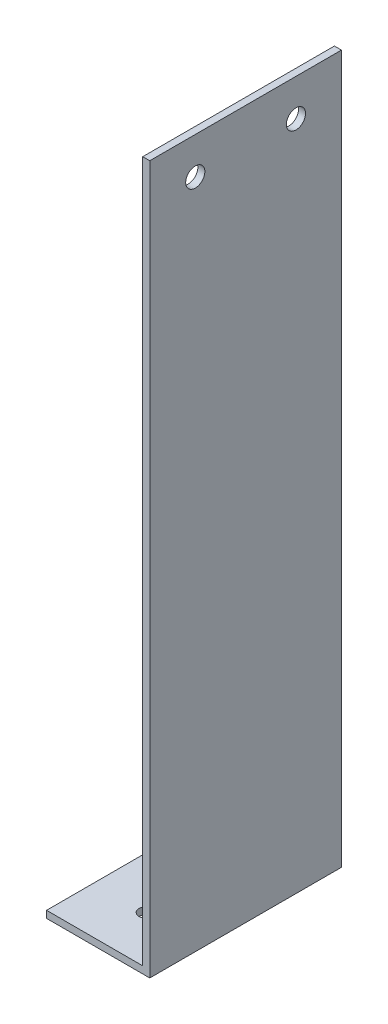
ISO-10303-21;
HEADER;
FILE_DESCRIPTION(('STEP AP214'),'2;1');
FILE_NAME('part.step','',(''),(''),'','','');
FILE_SCHEMA(('AUTOMOTIVE_DESIGN { 1 0 10303 214 1 1 1 1 }'));
ENDSEC;
DATA;
#1=APPLICATION_CONTEXT('core data for automotive mechanical design processes');
#2=APPLICATION_PROTOCOL_DEFINITION('international standard','automotive_design',2000,#1);
#3=PRODUCT_CONTEXT('',#1,'mechanical');
#4=PRODUCT('Part','Part','',(#3));
#5=PRODUCT_RELATED_PRODUCT_CATEGORY('part','',(#4));
#6=PRODUCT_DEFINITION_FORMATION('','',#4);
#7=PRODUCT_DEFINITION_CONTEXT('part definition',#1,'design');
#8=PRODUCT_DEFINITION('design','',#6,#7);
#9=PRODUCT_DEFINITION_SHAPE('','',#8);
#10=(LENGTH_UNIT() NAMED_UNIT(*) SI_UNIT(.MILLI.,.METRE.));
#11=(NAMED_UNIT(*) PLANE_ANGLE_UNIT() SI_UNIT($,.RADIAN.));
#12=(NAMED_UNIT(*) SI_UNIT($,.STERADIAN.) SOLID_ANGLE_UNIT());
#13=UNCERTAINTY_MEASURE_WITH_UNIT(LENGTH_MEASURE(1.E-05),#10,'distance_accuracy_value','');
#14=(GEOMETRIC_REPRESENTATION_CONTEXT(3) GLOBAL_UNCERTAINTY_ASSIGNED_CONTEXT((#13)) GLOBAL_UNIT_ASSIGNED_CONTEXT((#10,
#11,#12)) REPRESENTATION_CONTEXT('',''));
#15=CARTESIAN_POINT('',(0.,0.,0.));
#16=DIRECTION('',(0.,0.,1.));
#17=DIRECTION('',(1.,0.,0.));
#18=AXIS2_PLACEMENT_3D('',#15,#16,#17);
#19=CARTESIAN_POINT('',(0.,0.,65.));
#20=DIRECTION('',(0.,1.,0.));
#21=DIRECTION('',(-1.,0.,0.));
#22=AXIS2_PLACEMENT_3D('',#19,#20,#21);
#23=PLANE('',#22);
#24=CARTESIAN_POINT('',(-35.,0.,32.5));
#25=DIRECTION('',(0.,-1.,0.));
#26=DIRECTION('',(1.,0.,0.));
#27=AXIS2_PLACEMENT_3D('',#24,#25,#26);
#28=CIRCLE('',#27,4.7625);
#29=CARTESIAN_POINT('',(-30.2375,0.,32.5));
#30=VERTEX_POINT('',#29);
#31=EDGE_CURVE('E161',#30,#30,#28,.T.);
#32=ORIENTED_EDGE('',*,*,#31,.F.);
#33=EDGE_LOOP('',(#32));
#34=FACE_BOUND('',#33,.T.);
#35=CARTESIAN_POINT('',(-35.,0.,-32.5));
#36=DIRECTION('',(0.,-1.,0.));
#37=DIRECTION('',(1.,0.,0.));
#38=AXIS2_PLACEMENT_3D('',#35,#36,#37);
#39=CIRCLE('',#38,4.7625);
#40=CARTESIAN_POINT('',(-30.2375,0.,-32.5));
#41=VERTEX_POINT('',#40);
#42=EDGE_CURVE('E173',#41,#41,#39,.T.);
#43=ORIENTED_EDGE('',*,*,#42,.F.);
#44=EDGE_LOOP('',(#43));
#45=FACE_BOUND('',#44,.T.);
#46=DIRECTION('',(1.,0.,0.));
#47=VECTOR('',#46,1.);
#48=CARTESIAN_POINT('',(0.,0.,-65.));
#49=LINE('',#48,#47);
#50=CARTESIAN_POINT('',(-70.,0.,-65.));
#51=VERTEX_POINT('',#50);
#52=CARTESIAN_POINT('',(0.,0.,-65.));
#53=VERTEX_POINT('',#52);
#54=EDGE_CURVE('E130',#51,#53,#49,.T.);
#55=ORIENTED_EDGE('',*,*,#54,.T.);
#56=DIRECTION('',(0.,0.,-1.));
#57=VECTOR('',#56,1.);
#58=CARTESIAN_POINT('',(0.,0.,65.));
#59=LINE('',#58,#57);
#60=CARTESIAN_POINT('',(0.,0.,65.));
#61=VERTEX_POINT('',#60);
#62=EDGE_CURVE('E11',#61,#53,#59,.T.);
#63=ORIENTED_EDGE('',*,*,#62,.F.);
#64=DIRECTION('',(1.,0.,0.));
#65=VECTOR('',#64,1.);
#66=CARTESIAN_POINT('',(0.,0.,65.));
#67=LINE('',#66,#65);
#68=CARTESIAN_POINT('',(-70.,0.,65.));
#69=VERTEX_POINT('',#68);
#70=EDGE_CURVE('E147',#69,#61,#67,.T.);
#71=ORIENTED_EDGE('',*,*,#70,.F.);
#72=DIRECTION('',(0.,0.,-1.));
#73=VECTOR('',#72,1.);
#74=CARTESIAN_POINT('',(-70.,0.,65.));
#75=LINE('',#74,#73);
#76=EDGE_CURVE('E126',#69,#51,#75,.T.);
#77=ORIENTED_EDGE('',*,*,#76,.T.);
#78=EDGE_LOOP('',(#55,#63,#71,#77));
#79=FACE_BOUND('',#78,.T.);
#80=ADVANCED_FACE('F39',(#34,#45,#79),#23,.F.);
#81=CARTESIAN_POINT('',(0.,0.,65.));
#82=DIRECTION('',(-1.,0.,0.));
#83=DIRECTION('',(0.,0.,1.));
#84=AXIS2_PLACEMENT_3D('',#81,#82,#83);
#85=PLANE('',#84);
#86=CARTESIAN_POINT('',(0.,455.,34.13125));
#87=DIRECTION('',(1.,0.,0.));
#88=DIRECTION('',(0.,0.,-1.));
#89=AXIS2_PLACEMENT_3D('',#86,#87,#88);
#90=CIRCLE('',#89,6.5);
#91=CARTESIAN_POINT('',(0.,455.,27.63125));
#92=VERTEX_POINT('',#91);
#93=EDGE_CURVE('E167',#92,#92,#90,.T.);
#94=ORIENTED_EDGE('',*,*,#93,.F.);
#95=EDGE_LOOP('',(#94));
#96=FACE_BOUND('',#95,.T.);
#97=CARTESIAN_POINT('',(0.,455.,-34.13125));
#98=DIRECTION('',(1.,0.,0.));
#99=DIRECTION('',(0.,0.,1.));
#100=AXIS2_PLACEMENT_3D('',#97,#98,#99);
#101=CIRCLE('',#100,6.50000000000001);
#102=CARTESIAN_POINT('',(0.,455.,-27.63125));
#103=VERTEX_POINT('',#102);
#104=EDGE_CURVE('E175',#103,#103,#101,.T.);
#105=ORIENTED_EDGE('',*,*,#104,.F.);
#106=EDGE_LOOP('',(#105));
#107=FACE_BOUND('',#106,.T.);
#108=DIRECTION('',(0.,1.,0.));
#109=VECTOR('',#108,1.);
#110=CARTESIAN_POINT('',(0.,0.,-65.));
#111=LINE('',#110,#109);
#112=CARTESIAN_POINT('',(0.,480.,-65.));
#113=VERTEX_POINT('',#112);
#114=EDGE_CURVE('E134',#53,#113,#111,.T.);
#115=ORIENTED_EDGE('',*,*,#114,.T.);
#116=DIRECTION('',(0.,0.,-1.));
#117=VECTOR('',#116,1.);
#118=CARTESIAN_POINT('',(0.,480.,65.));
#119=LINE('',#118,#117);
#120=CARTESIAN_POINT('',(0.,480.,65.));
#121=VERTEX_POINT('',#120);
#122=EDGE_CURVE('E49',#121,#113,#119,.T.);
#123=ORIENTED_EDGE('',*,*,#122,.F.);
#124=DIRECTION('',(0.,1.,0.));
#125=VECTOR('',#124,1.);
#126=CARTESIAN_POINT('',(0.,0.,65.));
#127=LINE('',#126,#125);
#128=EDGE_CURVE('E95',#61,#121,#127,.T.);
#129=ORIENTED_EDGE('',*,*,#128,.F.);
#130=ORIENTED_EDGE('',*,*,#62,.T.);
#131=EDGE_LOOP('',(#115,#123,#129,#130));
#132=FACE_BOUND('',#131,.T.);
#133=ADVANCED_FACE('F195',(#96,#107,#132),#85,.F.);
#134=CARTESIAN_POINT('',(0.,480.,65.));
#135=DIRECTION('',(0.,-1.,0.));
#136=DIRECTION('',(0.,0.,-1.));
#137=AXIS2_PLACEMENT_3D('',#134,#135,#136);
#138=PLANE('',#137);
#139=DIRECTION('',(-1.,0.,0.));
#140=VECTOR('',#139,1.);
#141=CARTESIAN_POINT('',(0.,480.,-65.));
#142=LINE('',#141,#140);
#143=CARTESIAN_POINT('',(-4.7625,480.,-65.));
#144=VERTEX_POINT('',#143);
#145=EDGE_CURVE('E138',#113,#144,#142,.T.);
#146=ORIENTED_EDGE('',*,*,#145,.T.);
#147=DIRECTION('',(0.,0.,-1.));
#148=VECTOR('',#147,1.);
#149=CARTESIAN_POINT('',(-4.7625,480.,65.));
#150=LINE('',#149,#148);
#151=CARTESIAN_POINT('',(-4.7625,480.,65.));
#152=VERTEX_POINT('',#151);
#153=EDGE_CURVE('E119',#152,#144,#150,.T.);
#154=ORIENTED_EDGE('',*,*,#153,.F.);
#155=DIRECTION('',(-1.,0.,0.));
#156=VECTOR('',#155,1.);
#157=CARTESIAN_POINT('',(0.,480.,65.));
#158=LINE('',#157,#156);
#159=EDGE_CURVE('E108',#121,#152,#158,.T.);
#160=ORIENTED_EDGE('',*,*,#159,.F.);
#161=ORIENTED_EDGE('',*,*,#122,.T.);
#162=EDGE_LOOP('',(#146,#154,#160,#161));
#163=FACE_BOUND('',#162,.T.);
#164=ADVANCED_FACE('F198',(#163),#138,.F.);
#165=CARTESIAN_POINT('',(-4.7625,4.7625,65.));
#166=DIRECTION('',(1.,0.,0.));
#167=DIRECTION('',(0.,0.,-1.));
#168=AXIS2_PLACEMENT_3D('',#165,#166,#167);
#169=PLANE('',#168);
#170=CARTESIAN_POINT('',(-4.7625,455.,34.13125));
#171=DIRECTION('',(1.,0.,0.));
#172=DIRECTION('',(0.,0.,-1.));
#173=AXIS2_PLACEMENT_3D('',#170,#171,#172);
#174=CIRCLE('',#173,6.5);
#175=CARTESIAN_POINT('',(-4.7625,455.,27.63125));
#176=VERTEX_POINT('',#175);
#177=EDGE_CURVE('E42',#176,#176,#174,.T.);
#178=ORIENTED_EDGE('',*,*,#177,.T.);
#179=EDGE_LOOP('',(#178));
#180=FACE_BOUND('',#179,.T.);
#181=CARTESIAN_POINT('',(-4.7625,455.,-34.13125));
#182=DIRECTION('',(1.,0.,0.));
#183=DIRECTION('',(0.,0.,-1.));
#184=AXIS2_PLACEMENT_3D('',#181,#182,#183);
#185=CIRCLE('',#184,6.50000000000001);
#186=CARTESIAN_POINT('',(-4.7625,455.,-40.63125));
#187=VERTEX_POINT('',#186);
#188=EDGE_CURVE('E164',#187,#187,#185,.T.);
#189=ORIENTED_EDGE('',*,*,#188,.T.);
#190=EDGE_LOOP('',(#189));
#191=FACE_BOUND('',#190,.T.);
#192=DIRECTION('',(0.,-1.,0.));
#193=VECTOR('',#192,1.);
#194=CARTESIAN_POINT('',(-4.7625,4.7625,-65.));
#195=LINE('',#194,#193);
#196=CARTESIAN_POINT('',(-4.7625,4.7625,-65.));
#197=VERTEX_POINT('',#196);
#198=EDGE_CURVE('E117',#144,#197,#195,.T.);
#199=ORIENTED_EDGE('',*,*,#198,.T.);
#200=DIRECTION('',(0.,0.,-1.));
#201=VECTOR('',#200,1.);
#202=CARTESIAN_POINT('',(-4.7625,4.7625,65.));
#203=LINE('',#202,#201);
#204=CARTESIAN_POINT('',(-4.7625,4.7625,65.));
#205=VERTEX_POINT('',#204);
#206=EDGE_CURVE('E114',#205,#197,#203,.T.);
#207=ORIENTED_EDGE('',*,*,#206,.F.);
#208=DIRECTION('',(0.,-1.,0.));
#209=VECTOR('',#208,1.);
#210=CARTESIAN_POINT('',(-4.7625,4.7625,65.));
#211=LINE('',#210,#209);
#212=EDGE_CURVE('E102',#152,#205,#211,.T.);
#213=ORIENTED_EDGE('',*,*,#212,.F.);
#214=ORIENTED_EDGE('',*,*,#153,.T.);
#215=EDGE_LOOP('',(#199,#207,#213,#214));
#216=FACE_BOUND('',#215,.T.);
#217=ADVANCED_FACE('F115',(#180,#191,#216),#169,.F.);
#218=CARTESIAN_POINT('',(-4.7625,4.7625,65.));
#219=DIRECTION('',(0.,-1.,0.));
#220=DIRECTION('',(1.,0.,0.));
#221=AXIS2_PLACEMENT_3D('',#218,#219,#220);
#222=PLANE('',#221);
#223=CARTESIAN_POINT('',(-35.,4.7625,32.5));
#224=DIRECTION('',(0.,-1.,0.));
#225=DIRECTION('',(1.,0.,0.));
#226=AXIS2_PLACEMENT_3D('',#223,#224,#225);
#227=CIRCLE('',#226,4.7625);
#228=CARTESIAN_POINT('',(-30.2375,4.7625,32.5));
#229=VERTEX_POINT('',#228);
#230=EDGE_CURVE('E135',#229,#229,#227,.T.);
#231=ORIENTED_EDGE('',*,*,#230,.T.);
#232=EDGE_LOOP('',(#231));
#233=FACE_BOUND('',#232,.T.);
#234=CARTESIAN_POINT('',(-35.,4.7625,-32.5));
#235=DIRECTION('',(0.,-1.,0.));
#236=DIRECTION('',(1.,0.,0.));
#237=AXIS2_PLACEMENT_3D('',#234,#235,#236);
#238=CIRCLE('',#237,4.7625);
#239=CARTESIAN_POINT('',(-30.2375,4.7625,-32.5));
#240=VERTEX_POINT('',#239);
#241=EDGE_CURVE('E157',#240,#240,#238,.T.);
#242=ORIENTED_EDGE('',*,*,#241,.T.);
#243=EDGE_LOOP('',(#242));
#244=FACE_BOUND('',#243,.T.);
#245=DIRECTION('',(-1.,0.,0.));
#246=VECTOR('',#245,1.);
#247=CARTESIAN_POINT('',(-4.7625,4.7625,-65.));
#248=LINE('',#247,#246);
#249=CARTESIAN_POINT('',(-70.,4.76249999999999,-65.));
#250=VERTEX_POINT('',#249);
#251=EDGE_CURVE('E81',#197,#250,#248,.T.);
#252=ORIENTED_EDGE('',*,*,#251,.T.);
#253=DIRECTION('',(0.,0.,-1.));
#254=VECTOR('',#253,1.);
#255=CARTESIAN_POINT('',(-70.,4.76249999999999,65.));
#256=LINE('',#255,#254);
#257=CARTESIAN_POINT('',(-70.,4.76249999999999,65.));
#258=VERTEX_POINT('',#257);
#259=EDGE_CURVE('E120',#258,#250,#256,.T.);
#260=ORIENTED_EDGE('',*,*,#259,.F.);
#261=DIRECTION('',(-1.,0.,0.));
#262=VECTOR('',#261,1.);
#263=CARTESIAN_POINT('',(-4.7625,4.7625,65.));
#264=LINE('',#263,#262);
#265=EDGE_CURVE('E106',#205,#258,#264,.T.);
#266=ORIENTED_EDGE('',*,*,#265,.F.);
#267=ORIENTED_EDGE('',*,*,#206,.T.);
#268=EDGE_LOOP('',(#252,#260,#266,#267));
#269=FACE_BOUND('',#268,.T.);
#270=ADVANCED_FACE('F122',(#233,#244,#269),#222,.F.);
#271=CARTESIAN_POINT('',(-70.,0.,65.));
#272=DIRECTION('',(1.,0.,0.));
#273=DIRECTION('',(0.,0.,-1.));
#274=AXIS2_PLACEMENT_3D('',#271,#272,#273);
#275=PLANE('',#274);
#276=DIRECTION('',(0.,-1.,0.));
#277=VECTOR('',#276,1.);
#278=CARTESIAN_POINT('',(-70.,0.,-65.));
#279=LINE('',#278,#277);
#280=EDGE_CURVE('E87',#250,#51,#279,.T.);
#281=ORIENTED_EDGE('',*,*,#280,.T.);
#282=ORIENTED_EDGE('',*,*,#76,.F.);
#283=DIRECTION('',(0.,-1.,0.));
#284=VECTOR('',#283,1.);
#285=CARTESIAN_POINT('',(-70.,0.,65.));
#286=LINE('',#285,#284);
#287=EDGE_CURVE('E58',#258,#69,#286,.T.);
#288=ORIENTED_EDGE('',*,*,#287,.F.);
#289=ORIENTED_EDGE('',*,*,#259,.T.);
#290=EDGE_LOOP('',(#281,#282,#288,#289));
#291=FACE_BOUND('',#290,.T.);
#292=ADVANCED_FACE('F203',(#291),#275,.F.);
#293=CARTESIAN_POINT('',(0.,0.,65.));
#294=DIRECTION('',(0.,0.,-1.));
#295=DIRECTION('',(-1.,0.,0.));
#296=AXIS2_PLACEMENT_3D('',#293,#294,#295);
#297=PLANE('',#296);
#298=ORIENTED_EDGE('',*,*,#70,.T.);
#299=ORIENTED_EDGE('',*,*,#128,.T.);
#300=ORIENTED_EDGE('',*,*,#159,.T.);
#301=ORIENTED_EDGE('',*,*,#212,.T.);
#302=ORIENTED_EDGE('',*,*,#265,.T.);
#303=ORIENTED_EDGE('',*,*,#287,.T.);
#304=EDGE_LOOP('',(#298,#299,#300,#301,#302,#303));
#305=FACE_BOUND('',#304,.T.);
#306=ADVANCED_FACE('F104',(#305),#297,.F.);
#307=CARTESIAN_POINT('',(0.,0.,-65.));
#308=DIRECTION('',(0.,0.,-1.));
#309=DIRECTION('',(-1.,0.,0.));
#310=AXIS2_PLACEMENT_3D('',#307,#308,#309);
#311=PLANE('',#310);
#312=ORIENTED_EDGE('',*,*,#54,.F.);
#313=ORIENTED_EDGE('',*,*,#280,.F.);
#314=ORIENTED_EDGE('',*,*,#251,.F.);
#315=ORIENTED_EDGE('',*,*,#198,.F.);
#316=ORIENTED_EDGE('',*,*,#145,.F.);
#317=ORIENTED_EDGE('',*,*,#114,.F.);
#318=EDGE_LOOP('',(#312,#313,#314,#315,#316,#317));
#319=FACE_BOUND('',#318,.T.);
#320=ADVANCED_FACE('F201',(#319),#311,.T.);
#321=CARTESIAN_POINT('',(-35.,130.,-32.5));
#322=DIRECTION('',(0.,-1.,0.));
#323=DIRECTION('',(1.,0.,0.));
#324=AXIS2_PLACEMENT_3D('',#321,#322,#323);
#325=CYLINDRICAL_SURFACE('',#324,4.7625);
#326=ORIENTED_EDGE('',*,*,#42,.T.);
#327=EDGE_LOOP('',(#326));
#328=FACE_BOUND('',#327,.T.);
#329=ORIENTED_EDGE('',*,*,#241,.F.);
#330=EDGE_LOOP('',(#329));
#331=FACE_BOUND('',#330,.T.);
#332=ADVANCED_FACE('F224',(#328,#331),#325,.F.);
#333=CARTESIAN_POINT('',(-35.,130.,32.5));
#334=DIRECTION('',(0.,-1.,0.));
#335=DIRECTION('',(1.,0.,0.));
#336=AXIS2_PLACEMENT_3D('',#333,#334,#335);
#337=CYLINDRICAL_SURFACE('',#336,4.7625);
#338=ORIENTED_EDGE('',*,*,#31,.T.);
#339=EDGE_LOOP('',(#338));
#340=FACE_BOUND('',#339,.T.);
#341=ORIENTED_EDGE('',*,*,#230,.F.);
#342=EDGE_LOOP('',(#341));
#343=FACE_BOUND('',#342,.T.);
#344=ADVANCED_FACE('F227',(#340,#343),#337,.F.);
#345=CARTESIAN_POINT('',(-130.,455.,-34.13125));
#346=DIRECTION('',(1.,0.,0.));
#347=DIRECTION('',(0.,0.,-1.));
#348=AXIS2_PLACEMENT_3D('',#345,#346,#347);
#349=CYLINDRICAL_SURFACE('',#348,6.50000000000001);
#350=ORIENTED_EDGE('',*,*,#104,.T.);
#351=EDGE_LOOP('',(#350));
#352=FACE_BOUND('',#351,.T.);
#353=ORIENTED_EDGE('',*,*,#188,.F.);
#354=EDGE_LOOP('',(#353));
#355=FACE_BOUND('',#354,.T.);
#356=ADVANCED_FACE('F235',(#352,#355),#349,.F.);
#357=CARTESIAN_POINT('',(-130.,455.,34.13125));
#358=DIRECTION('',(1.,0.,0.));
#359=DIRECTION('',(0.,0.,-1.));
#360=AXIS2_PLACEMENT_3D('',#357,#358,#359);
#361=CYLINDRICAL_SURFACE('',#360,6.5);
#362=ORIENTED_EDGE('',*,*,#93,.T.);
#363=EDGE_LOOP('',(#362));
#364=FACE_BOUND('',#363,.T.);
#365=ORIENTED_EDGE('',*,*,#177,.F.);
#366=EDGE_LOOP('',(#365));
#367=FACE_BOUND('',#366,.T.);
#368=ADVANCED_FACE('F241',(#364,#367),#361,.F.);
#369=CLOSED_SHELL('',(#80,#133,#164,#217,#270,#292,#306,#320,#332,#344,#356,#368));
#370=MANIFOLD_SOLID_BREP('B2',#369);
#371=ADVANCED_BREP_SHAPE_REPRESENTATION('',(#18,#370),#14);
#372=SHAPE_DEFINITION_REPRESENTATION(#9,#371);
ENDSEC;
END-ISO-10303-21;
